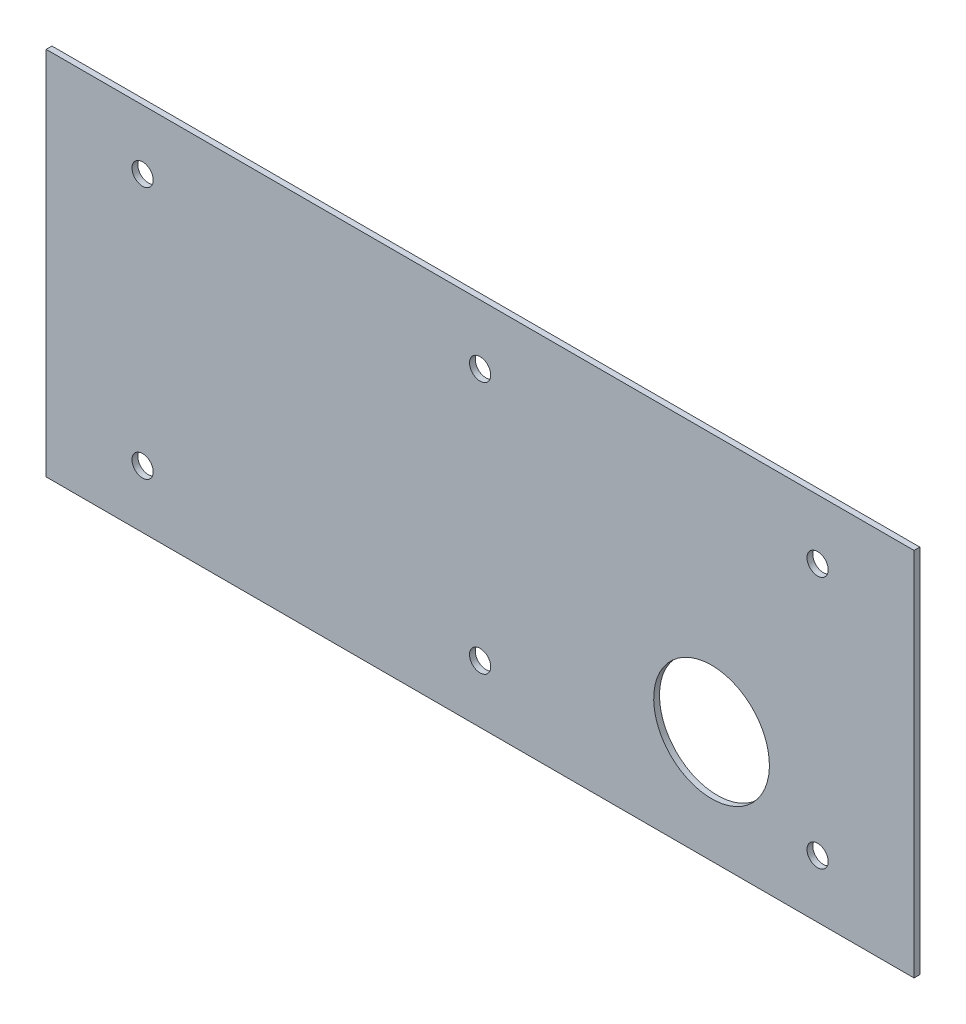
ISO-10303-21;
HEADER;
FILE_DESCRIPTION(('STEP AP214'),'2;1');
FILE_NAME('part.step','',(''),(''),'','','');
FILE_SCHEMA(('AUTOMOTIVE_DESIGN { 1 0 10303 214 1 1 1 1 }'));
ENDSEC;
DATA;
#1=APPLICATION_CONTEXT('core data for automotive mechanical design processes');
#2=APPLICATION_PROTOCOL_DEFINITION('international standard','automotive_design',2000,#1);
#3=PRODUCT_CONTEXT('',#1,'mechanical');
#4=PRODUCT('Part','Part','',(#3));
#5=PRODUCT_RELATED_PRODUCT_CATEGORY('part','',(#4));
#6=PRODUCT_DEFINITION_FORMATION('','',#4);
#7=PRODUCT_DEFINITION_CONTEXT('part definition',#1,'design');
#8=PRODUCT_DEFINITION('design','',#6,#7);
#9=PRODUCT_DEFINITION_SHAPE('','',#8);
#10=(LENGTH_UNIT() NAMED_UNIT(*) SI_UNIT(.MILLI.,.METRE.));
#11=(NAMED_UNIT(*) PLANE_ANGLE_UNIT() SI_UNIT($,.RADIAN.));
#12=(NAMED_UNIT(*) SI_UNIT($,.STERADIAN.) SOLID_ANGLE_UNIT());
#13=UNCERTAINTY_MEASURE_WITH_UNIT(LENGTH_MEASURE(1.E-05),#10,'distance_accuracy_value','');
#14=(GEOMETRIC_REPRESENTATION_CONTEXT(3) GLOBAL_UNCERTAINTY_ASSIGNED_CONTEXT((#13)) GLOBAL_UNIT_ASSIGNED_CONTEXT((#10,
#11,#12)) REPRESENTATION_CONTEXT('',''));
#15=CARTESIAN_POINT('',(0.,0.,0.));
#16=DIRECTION('',(0.,0.,1.));
#17=DIRECTION('',(1.,0.,0.));
#18=AXIS2_PLACEMENT_3D('',#15,#16,#17);
#19=CARTESIAN_POINT('',(-64.1196120818355,132.737934288001,3.));
#20=DIRECTION('',(0.,-1.,0.));
#21=DIRECTION('',(0.,0.,-1.));
#22=AXIS2_PLACEMENT_3D('',#19,#20,#21);
#23=PLANE('',#22);
#24=DIRECTION('',(-1.,0.,0.));
#25=VECTOR('',#24,1.);
#26=CARTESIAN_POINT('',(-64.1196120818355,132.737934288001,0.));
#27=LINE('',#26,#25);
#28=CARTESIAN_POINT('',(385.880387918165,132.737934288001,0.));
#29=VERTEX_POINT('',#28);
#30=CARTESIAN_POINT('',(-64.1196120818355,132.737934288001,0.));
#31=VERTEX_POINT('',#30);
#32=EDGE_CURVE('E112',#29,#31,#27,.T.);
#33=ORIENTED_EDGE('',*,*,#32,.T.);
#34=DIRECTION('',(0.,0.,-1.));
#35=VECTOR('',#34,1.);
#36=CARTESIAN_POINT('',(-64.1196120818355,132.737934288001,3.));
#37=LINE('',#36,#35);
#38=CARTESIAN_POINT('',(-64.1196120818355,132.737934288001,3.));
#39=VERTEX_POINT('',#38);
#40=EDGE_CURVE('E11',#39,#31,#37,.T.);
#41=ORIENTED_EDGE('',*,*,#40,.F.);
#42=DIRECTION('',(-1.,0.,0.));
#43=VECTOR('',#42,1.);
#44=CARTESIAN_POINT('',(-64.1196120818355,132.737934288001,3.));
#45=LINE('',#44,#43);
#46=CARTESIAN_POINT('',(385.880387918165,132.737934288001,3.));
#47=VERTEX_POINT('',#46);
#48=EDGE_CURVE('E93',#47,#39,#45,.T.);
#49=ORIENTED_EDGE('',*,*,#48,.F.);
#50=DIRECTION('',(0.,0.,-1.));
#51=VECTOR('',#50,1.);
#52=CARTESIAN_POINT('',(385.880387918165,132.737934288001,3.));
#53=LINE('',#52,#51);
#54=EDGE_CURVE('E108',#47,#29,#53,.T.);
#55=ORIENTED_EDGE('',*,*,#54,.T.);
#56=EDGE_LOOP('',(#33,#41,#49,#55));
#57=FACE_BOUND('',#56,.T.);
#58=ADVANCED_FACE('F39',(#57),#23,.F.);
#59=CARTESIAN_POINT('',(-64.1196120818355,132.737934288001,3.));
#60=DIRECTION('',(1.,0.,0.));
#61=DIRECTION('',(0.,1.,0.));
#62=AXIS2_PLACEMENT_3D('',#59,#60,#61);
#63=PLANE('',#62);
#64=DIRECTION('',(0.,-1.,0.));
#65=VECTOR('',#64,1.);
#66=CARTESIAN_POINT('',(-64.1196120818355,132.737934288001,0.));
#67=LINE('',#66,#65);
#68=CARTESIAN_POINT('',(-64.1196120818355,-59.2620657119994,0.));
#69=VERTEX_POINT('',#68);
#70=EDGE_CURVE('E98',#31,#69,#67,.T.);
#71=ORIENTED_EDGE('',*,*,#70,.T.);
#72=DIRECTION('',(0.,0.,-1.));
#73=VECTOR('',#72,1.);
#74=CARTESIAN_POINT('',(-64.1196120818355,-59.2620657119994,3.));
#75=LINE('',#74,#73);
#76=CARTESIAN_POINT('',(-64.1196120818355,-59.2620657119994,3.));
#77=VERTEX_POINT('',#76);
#78=EDGE_CURVE('E49',#77,#69,#75,.T.);
#79=ORIENTED_EDGE('',*,*,#78,.F.);
#80=DIRECTION('',(0.,-1.,0.));
#81=VECTOR('',#80,1.);
#82=CARTESIAN_POINT('',(-64.1196120818355,132.737934288001,3.));
#83=LINE('',#82,#81);
#84=EDGE_CURVE('E88',#39,#77,#83,.T.);
#85=ORIENTED_EDGE('',*,*,#84,.F.);
#86=ORIENTED_EDGE('',*,*,#40,.T.);
#87=EDGE_LOOP('',(#71,#79,#85,#86));
#88=FACE_BOUND('',#87,.T.);
#89=ADVANCED_FACE('F97',(#88),#63,.F.);
#90=CARTESIAN_POINT('',(385.880387918165,-59.2620657119994,3.));
#91=DIRECTION('',(0.,1.,0.));
#92=DIRECTION('',(0.,0.,1.));
#93=AXIS2_PLACEMENT_3D('',#90,#91,#92);
#94=PLANE('',#93);
#95=DIRECTION('',(1.,0.,0.));
#96=VECTOR('',#95,1.);
#97=CARTESIAN_POINT('',(385.880387918165,-59.2620657119994,0.));
#98=LINE('',#97,#96);
#99=CARTESIAN_POINT('',(385.880387918165,-59.2620657119994,0.));
#100=VERTEX_POINT('',#99);
#101=EDGE_CURVE('E75',#69,#100,#98,.T.);
#102=ORIENTED_EDGE('',*,*,#101,.T.);
#103=DIRECTION('',(0.,0.,-1.));
#104=VECTOR('',#103,1.);
#105=CARTESIAN_POINT('',(385.880387918165,-59.2620657119994,3.));
#106=LINE('',#105,#104);
#107=CARTESIAN_POINT('',(385.880387918165,-59.2620657119994,3.));
#108=VERTEX_POINT('',#107);
#109=EDGE_CURVE('E100',#108,#100,#106,.T.);
#110=ORIENTED_EDGE('',*,*,#109,.F.);
#111=DIRECTION('',(1.,0.,0.));
#112=VECTOR('',#111,1.);
#113=CARTESIAN_POINT('',(385.880387918165,-59.2620657119994,3.));
#114=LINE('',#113,#112);
#115=EDGE_CURVE('E91',#77,#108,#114,.T.);
#116=ORIENTED_EDGE('',*,*,#115,.F.);
#117=ORIENTED_EDGE('',*,*,#78,.T.);
#118=EDGE_LOOP('',(#102,#110,#116,#117));
#119=FACE_BOUND('',#118,.T.);
#120=ADVANCED_FACE('F102',(#119),#94,.F.);
#121=CARTESIAN_POINT('',(385.880387918165,132.737934288001,3.));
#122=DIRECTION('',(-1.,0.,0.));
#123=DIRECTION('',(0.,0.,1.));
#124=AXIS2_PLACEMENT_3D('',#121,#122,#123);
#125=PLANE('',#124);
#126=DIRECTION('',(0.,1.,0.));
#127=VECTOR('',#126,1.);
#128=CARTESIAN_POINT('',(385.880387918165,132.737934288001,0.));
#129=LINE('',#128,#127);
#130=EDGE_CURVE('E81',#100,#29,#129,.T.);
#131=ORIENTED_EDGE('',*,*,#130,.T.);
#132=ORIENTED_EDGE('',*,*,#54,.F.);
#133=DIRECTION('',(0.,1.,0.));
#134=VECTOR('',#133,1.);
#135=CARTESIAN_POINT('',(385.880387918165,132.737934288001,3.));
#136=LINE('',#135,#134);
#137=EDGE_CURVE('E58',#108,#47,#136,.T.);
#138=ORIENTED_EDGE('',*,*,#137,.F.);
#139=ORIENTED_EDGE('',*,*,#109,.T.);
#140=EDGE_LOOP('',(#131,#132,#138,#139));
#141=FACE_BOUND('',#140,.T.);
#142=ADVANCED_FACE('F213',(#141),#125,.F.);
#143=CARTESIAN_POINT('',(0.,0.,3.));
#144=DIRECTION('',(0.,0.,-1.));
#145=DIRECTION('',(-1.,0.,0.));
#146=AXIS2_PLACEMENT_3D('',#143,#144,#145);
#147=PLANE('',#146);
#148=CARTESIAN_POINT('',(335.880387918164,101.733357346664,3.00000000000087));
#149=DIRECTION('',(0.,0.,-1.));
#150=DIRECTION('',(0.,1.,0.));
#151=AXIS2_PLACEMENT_3D('',#148,#149,#150);
#152=CIRCLE('',#151,5.50000000000001);
#153=CARTESIAN_POINT('',(335.880387918164,107.233357346664,3.00000000000089));
#154=VERTEX_POINT('',#153);
#155=EDGE_CURVE('E176',#154,#154,#152,.T.);
#156=ORIENTED_EDGE('',*,*,#155,.T.);
#157=EDGE_LOOP('',(#156));
#158=FACE_BOUND('',#157,.T.);
#159=CARTESIAN_POINT('',(160.880387918164,101.733357346664,3.00000000000087));
#160=DIRECTION('',(0.,0.,-1.));
#161=DIRECTION('',(0.,1.,0.));
#162=AXIS2_PLACEMENT_3D('',#159,#160,#161);
#163=CIRCLE('',#162,5.49999999999998);
#164=CARTESIAN_POINT('',(160.880387918164,107.233357346664,3.00000000000089));
#165=VERTEX_POINT('',#164);
#166=EDGE_CURVE('E166',#165,#165,#163,.T.);
#167=ORIENTED_EDGE('',*,*,#166,.T.);
#168=EDGE_LOOP('',(#167));
#169=FACE_BOUND('',#168,.T.);
#170=CARTESIAN_POINT('',(-14.1196120818362,101.733357346664,3.00000000000087));
#171=DIRECTION('',(0.,0.,-1.));
#172=DIRECTION('',(0.,1.,0.));
#173=AXIS2_PLACEMENT_3D('',#170,#171,#172);
#174=CIRCLE('',#173,5.49999999999999);
#175=CARTESIAN_POINT('',(-14.1196120818362,107.233357346664,3.00000000000089));
#176=VERTEX_POINT('',#175);
#177=EDGE_CURVE('E148',#176,#176,#174,.T.);
#178=ORIENTED_EDGE('',*,*,#177,.T.);
#179=EDGE_LOOP('',(#178));
#180=FACE_BOUND('',#179,.T.);
#181=CARTESIAN_POINT('',(-14.1196120818362,-29.2666426533355,3.00000000000041));
#182=DIRECTION('',(0.,0.,-1.));
#183=DIRECTION('',(0.,1.,0.));
#184=AXIS2_PLACEMENT_3D('',#181,#182,#183);
#185=CIRCLE('',#184,5.49999999999999);
#186=CARTESIAN_POINT('',(-14.1196120818362,-23.7666426533355,3.00000000000043));
#187=VERTEX_POINT('',#186);
#188=EDGE_CURVE('E134',#187,#187,#185,.T.);
#189=ORIENTED_EDGE('',*,*,#188,.T.);
#190=EDGE_LOOP('',(#189));
#191=FACE_BOUND('',#190,.T.);
#192=CARTESIAN_POINT('',(160.880387918164,-29.2666426533355,3.00000000000041));
#193=DIRECTION('',(0.,0.,-1.));
#194=DIRECTION('',(0.,1.,0.));
#195=AXIS2_PLACEMENT_3D('',#192,#193,#194);
#196=CIRCLE('',#195,5.49999999999998);
#197=CARTESIAN_POINT('',(160.880387918164,-23.7666426533355,3.00000000000043));
#198=VERTEX_POINT('',#197);
#199=EDGE_CURVE('E133',#198,#198,#196,.T.);
#200=ORIENTED_EDGE('',*,*,#199,.T.);
#201=EDGE_LOOP('',(#200));
#202=FACE_BOUND('',#201,.T.);
#203=CARTESIAN_POINT('',(335.880387918164,-29.2666426533355,3.00000000000041));
#204=DIRECTION('',(0.,0.,-1.));
#205=DIRECTION('',(0.,1.,0.));
#206=AXIS2_PLACEMENT_3D('',#203,#204,#205);
#207=CIRCLE('',#206,5.50000000000001);
#208=CARTESIAN_POINT('',(335.880387918164,-23.7666426533355,3.00000000000043));
#209=VERTEX_POINT('',#208);
#210=EDGE_CURVE('E155',#209,#209,#207,.T.);
#211=ORIENTED_EDGE('',*,*,#210,.T.);
#212=EDGE_LOOP('',(#211));
#213=FACE_BOUND('',#212,.T.);
#214=CARTESIAN_POINT('',(280.880387918164,-1.26664265333544,3.0000000000002));
#215=DIRECTION('',(0.,0.,-1.));
#216=DIRECTION('',(0.,1.,0.));
#217=AXIS2_PLACEMENT_3D('',#214,#215,#216);
#218=CIRCLE('',#217,30.);
#219=CARTESIAN_POINT('',(280.880387918164,28.7333573466645,3.00000000000031));
#220=VERTEX_POINT('',#219);
#221=EDGE_CURVE('E129',#220,#220,#218,.T.);
#222=ORIENTED_EDGE('',*,*,#221,.T.);
#223=EDGE_LOOP('',(#222));
#224=FACE_BOUND('',#223,.T.);
#225=ORIENTED_EDGE('',*,*,#48,.T.);
#226=ORIENTED_EDGE('',*,*,#84,.T.);
#227=ORIENTED_EDGE('',*,*,#115,.T.);
#228=ORIENTED_EDGE('',*,*,#137,.T.);
#229=EDGE_LOOP('',(#225,#226,#227,#228));
#230=FACE_BOUND('',#229,.T.);
#231=ADVANCED_FACE('F89',(#158,#169,#180,#191,#202,#213,#224,#230),#147,.F.);
#232=CARTESIAN_POINT('',(0.,0.,0.));
#233=DIRECTION('',(0.,0.,-1.));
#234=DIRECTION('',(-1.,0.,0.));
#235=AXIS2_PLACEMENT_3D('',#232,#233,#234);
#236=PLANE('',#235);
#237=CARTESIAN_POINT('',(335.880387918164,101.733357346665,0.));
#238=DIRECTION('',(0.,0.,-1.));
#239=DIRECTION('',(-1.,0.,0.));
#240=AXIS2_PLACEMENT_3D('',#237,#238,#239);
#241=CIRCLE('',#240,5.50000000000001);
#242=CARTESIAN_POINT('',(330.380387918164,101.733357346665,0.));
#243=VERTEX_POINT('',#242);
#244=EDGE_CURVE('E169',#243,#243,#241,.T.);
#245=ORIENTED_EDGE('',*,*,#244,.F.);
#246=EDGE_LOOP('',(#245));
#247=FACE_BOUND('',#246,.T.);
#248=CARTESIAN_POINT('',(160.880387918164,101.733357346665,0.));
#249=DIRECTION('',(0.,0.,-1.));
#250=DIRECTION('',(-1.,0.,0.));
#251=AXIS2_PLACEMENT_3D('',#248,#249,#250);
#252=CIRCLE('',#251,5.49999999999998);
#253=CARTESIAN_POINT('',(155.380387918164,101.733357346665,0.));
#254=VERTEX_POINT('',#253);
#255=EDGE_CURVE('E168',#254,#254,#252,.T.);
#256=ORIENTED_EDGE('',*,*,#255,.F.);
#257=EDGE_LOOP('',(#256));
#258=FACE_BOUND('',#257,.T.);
#259=CARTESIAN_POINT('',(-14.1196120818362,101.733357346665,0.));
#260=DIRECTION('',(0.,0.,-1.));
#261=DIRECTION('',(-1.,0.,0.));
#262=AXIS2_PLACEMENT_3D('',#259,#260,#261);
#263=CIRCLE('',#262,5.49999999999999);
#264=CARTESIAN_POINT('',(-19.6196120818362,101.733357346665,0.));
#265=VERTEX_POINT('',#264);
#266=EDGE_CURVE('E42',#265,#265,#263,.T.);
#267=ORIENTED_EDGE('',*,*,#266,.F.);
#268=EDGE_LOOP('',(#267));
#269=FACE_BOUND('',#268,.T.);
#270=CARTESIAN_POINT('',(-14.1196120818362,-29.2666426533355,0.));
#271=DIRECTION('',(0.,0.,-1.));
#272=DIRECTION('',(-1.,0.,0.));
#273=AXIS2_PLACEMENT_3D('',#270,#271,#272);
#274=CIRCLE('',#273,5.49999999999999);
#275=CARTESIAN_POINT('',(-19.6196120818362,-29.2666426533355,0.));
#276=VERTEX_POINT('',#275);
#277=EDGE_CURVE('E130',#276,#276,#274,.T.);
#278=ORIENTED_EDGE('',*,*,#277,.F.);
#279=EDGE_LOOP('',(#278));
#280=FACE_BOUND('',#279,.T.);
#281=CARTESIAN_POINT('',(160.880387918164,-29.2666426533355,0.));
#282=DIRECTION('',(0.,0.,-1.));
#283=DIRECTION('',(-1.,0.,0.));
#284=AXIS2_PLACEMENT_3D('',#281,#282,#283);
#285=CIRCLE('',#284,5.49999999999998);
#286=CARTESIAN_POINT('',(155.380387918164,-29.2666426533355,0.));
#287=VERTEX_POINT('',#286);
#288=EDGE_CURVE('E139',#287,#287,#285,.T.);
#289=ORIENTED_EDGE('',*,*,#288,.F.);
#290=EDGE_LOOP('',(#289));
#291=FACE_BOUND('',#290,.T.);
#292=CARTESIAN_POINT('',(335.880387918164,-29.2666426533355,0.));
#293=DIRECTION('',(0.,0.,-1.));
#294=DIRECTION('',(-1.,0.,0.));
#295=AXIS2_PLACEMENT_3D('',#292,#293,#294);
#296=CIRCLE('',#295,5.50000000000001);
#297=CARTESIAN_POINT('',(330.380387918164,-29.2666426533355,0.));
#298=VERTEX_POINT('',#297);
#299=EDGE_CURVE('E159',#298,#298,#296,.T.);
#300=ORIENTED_EDGE('',*,*,#299,.F.);
#301=EDGE_LOOP('',(#300));
#302=FACE_BOUND('',#301,.T.);
#303=CARTESIAN_POINT('',(280.880387918164,-1.26664265333543,0.));
#304=DIRECTION('',(0.,0.,-1.));
#305=DIRECTION('',(-1.,0.,0.));
#306=AXIS2_PLACEMENT_3D('',#303,#304,#305);
#307=CIRCLE('',#306,30.);
#308=CARTESIAN_POINT('',(250.880387918164,-1.26664265333543,0.));
#309=VERTEX_POINT('',#308);
#310=EDGE_CURVE('E116',#309,#309,#307,.T.);
#311=ORIENTED_EDGE('',*,*,#310,.F.);
#312=EDGE_LOOP('',(#311));
#313=FACE_BOUND('',#312,.T.);
#314=ORIENTED_EDGE('',*,*,#32,.F.);
#315=ORIENTED_EDGE('',*,*,#130,.F.);
#316=ORIENTED_EDGE('',*,*,#101,.F.);
#317=ORIENTED_EDGE('',*,*,#70,.F.);
#318=EDGE_LOOP('',(#314,#315,#316,#317));
#319=FACE_BOUND('',#318,.T.);
#320=ADVANCED_FACE('F201',(#247,#258,#269,#280,#291,#302,#313,#319),#236,.T.);
#321=CARTESIAN_POINT('',(280.880387918164,-1.26664265333544,3.0000000000002));
#322=DIRECTION('',(0.,0.,-1.));
#323=DIRECTION('',(0.,1.,0.));
#324=AXIS2_PLACEMENT_3D('',#321,#322,#323);
#325=CYLINDRICAL_SURFACE('',#324,30.);
#326=ORIENTED_EDGE('',*,*,#310,.T.);
#327=EDGE_LOOP('',(#326));
#328=FACE_BOUND('',#327,.T.);
#329=ORIENTED_EDGE('',*,*,#221,.F.);
#330=EDGE_LOOP('',(#329));
#331=FACE_BOUND('',#330,.T.);
#332=ADVANCED_FACE('F203',(#328,#331),#325,.F.);
#333=CARTESIAN_POINT('',(335.880387918164,-29.2666426533353,-48.9999999999952));
#334=DIRECTION('',(0.,0.,-1.));
#335=DIRECTION('',(0.,1.,0.));
#336=AXIS2_PLACEMENT_3D('',#333,#334,#335);
#337=CYLINDRICAL_SURFACE('',#336,5.50000000000001);
#338=ORIENTED_EDGE('',*,*,#299,.T.);
#339=EDGE_LOOP('',(#338));
#340=FACE_BOUND('',#339,.T.);
#341=ORIENTED_EDGE('',*,*,#210,.F.);
#342=EDGE_LOOP('',(#341));
#343=FACE_BOUND('',#342,.T.);
#344=ADVANCED_FACE('F210',(#340,#343),#337,.F.);
#345=CARTESIAN_POINT('',(160.880387918164,-29.2666426533353,-48.9999999999952));
#346=DIRECTION('',(0.,0.,-1.));
#347=DIRECTION('',(0.,1.,0.));
#348=AXIS2_PLACEMENT_3D('',#345,#346,#347);
#349=CYLINDRICAL_SURFACE('',#348,5.49999999999998);
#350=ORIENTED_EDGE('',*,*,#288,.T.);
#351=EDGE_LOOP('',(#350));
#352=FACE_BOUND('',#351,.T.);
#353=ORIENTED_EDGE('',*,*,#199,.F.);
#354=EDGE_LOOP('',(#353));
#355=FACE_BOUND('',#354,.T.);
#356=ADVANCED_FACE('F246',(#352,#355),#349,.F.);
#357=CARTESIAN_POINT('',(-14.1196120818362,-29.2666426533353,-48.9999999999952));
#358=DIRECTION('',(0.,0.,-1.));
#359=DIRECTION('',(0.,1.,0.));
#360=AXIS2_PLACEMENT_3D('',#357,#358,#359);
#361=CYLINDRICAL_SURFACE('',#360,5.49999999999999);
#362=ORIENTED_EDGE('',*,*,#277,.T.);
#363=EDGE_LOOP('',(#362));
#364=FACE_BOUND('',#363,.T.);
#365=ORIENTED_EDGE('',*,*,#188,.F.);
#366=EDGE_LOOP('',(#365));
#367=FACE_BOUND('',#366,.T.);
#368=ADVANCED_FACE('F256',(#364,#367),#361,.F.);
#369=CARTESIAN_POINT('',(-14.1196120818362,101.733357346665,-48.9999999999947));
#370=DIRECTION('',(0.,0.,-1.));
#371=DIRECTION('',(0.,1.,0.));
#372=AXIS2_PLACEMENT_3D('',#369,#370,#371);
#373=CYLINDRICAL_SURFACE('',#372,5.49999999999999);
#374=ORIENTED_EDGE('',*,*,#266,.T.);
#375=EDGE_LOOP('',(#374));
#376=FACE_BOUND('',#375,.T.);
#377=ORIENTED_EDGE('',*,*,#177,.F.);
#378=EDGE_LOOP('',(#377));
#379=FACE_BOUND('',#378,.T.);
#380=ADVANCED_FACE('F192',(#376,#379),#373,.F.);
#381=CARTESIAN_POINT('',(160.880387918164,101.733357346665,-48.9999999999947));
#382=DIRECTION('',(0.,0.,-1.));
#383=DIRECTION('',(0.,1.,0.));
#384=AXIS2_PLACEMENT_3D('',#381,#382,#383);
#385=CYLINDRICAL_SURFACE('',#384,5.49999999999998);
#386=ORIENTED_EDGE('',*,*,#255,.T.);
#387=EDGE_LOOP('',(#386));
#388=FACE_BOUND('',#387,.T.);
#389=ORIENTED_EDGE('',*,*,#166,.F.);
#390=EDGE_LOOP('',(#389));
#391=FACE_BOUND('',#390,.T.);
#392=ADVANCED_FACE('F186',(#388,#391),#385,.F.);
#393=CARTESIAN_POINT('',(335.880387918164,101.733357346665,-48.9999999999947));
#394=DIRECTION('',(0.,0.,-1.));
#395=DIRECTION('',(0.,1.,0.));
#396=AXIS2_PLACEMENT_3D('',#393,#394,#395);
#397=CYLINDRICAL_SURFACE('',#396,5.50000000000001);
#398=ORIENTED_EDGE('',*,*,#244,.T.);
#399=EDGE_LOOP('',(#398));
#400=FACE_BOUND('',#399,.T.);
#401=ORIENTED_EDGE('',*,*,#155,.F.);
#402=EDGE_LOOP('',(#401));
#403=FACE_BOUND('',#402,.T.);
#404=ADVANCED_FACE('F184',(#400,#403),#397,.F.);
#405=CLOSED_SHELL('',(#58,#89,#120,#142,#231,#320,#332,#344,#356,#368,#380,#392,#404));
#406=MANIFOLD_SOLID_BREP('B2',#405);
#407=ADVANCED_BREP_SHAPE_REPRESENTATION('',(#18,#406),#14);
#408=SHAPE_DEFINITION_REPRESENTATION(#9,#407);
ENDSEC;
END-ISO-10303-21;
